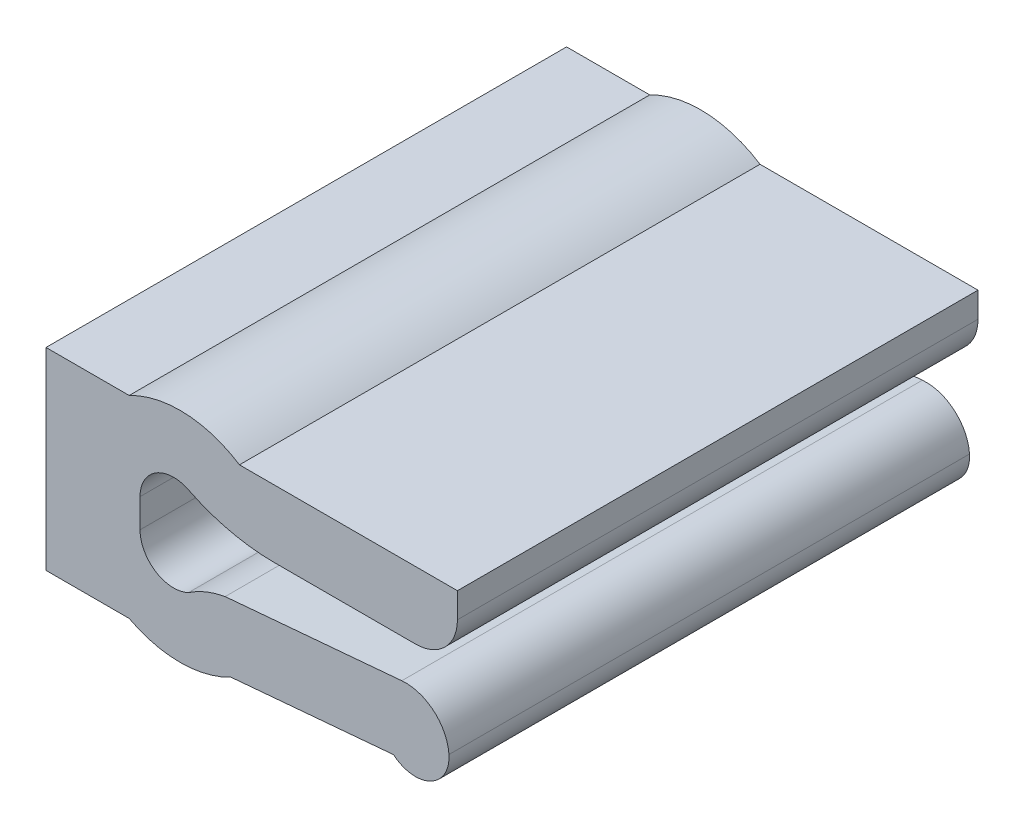
ISO-10303-21;
HEADER;
FILE_DESCRIPTION(('STEP AP214'),'2;1');
FILE_NAME('part.step','',(''),(''),'','','');
FILE_SCHEMA(('AUTOMOTIVE_DESIGN { 1 0 10303 214 1 1 1 1 }'));
ENDSEC;
DATA;
#1=APPLICATION_CONTEXT('core data for automotive mechanical design processes');
#2=APPLICATION_PROTOCOL_DEFINITION('international standard','automotive_design',2000,#1);
#3=PRODUCT_CONTEXT('',#1,'mechanical');
#4=PRODUCT('Part','Part','',(#3));
#5=PRODUCT_RELATED_PRODUCT_CATEGORY('part','',(#4));
#6=PRODUCT_DEFINITION_FORMATION('','',#4);
#7=PRODUCT_DEFINITION_CONTEXT('part definition',#1,'design');
#8=PRODUCT_DEFINITION('design','',#6,#7);
#9=PRODUCT_DEFINITION_SHAPE('','',#8);
#10=(LENGTH_UNIT() NAMED_UNIT(*) SI_UNIT(.MILLI.,.METRE.));
#11=(NAMED_UNIT(*) PLANE_ANGLE_UNIT() SI_UNIT($,.RADIAN.));
#12=(NAMED_UNIT(*) SI_UNIT($,.STERADIAN.) SOLID_ANGLE_UNIT());
#13=UNCERTAINTY_MEASURE_WITH_UNIT(LENGTH_MEASURE(1.E-05),#10,'distance_accuracy_value','');
#14=(GEOMETRIC_REPRESENTATION_CONTEXT(3) GLOBAL_UNCERTAINTY_ASSIGNED_CONTEXT((#13)) GLOBAL_UNIT_ASSIGNED_CONTEXT((#10,
#11,#12)) REPRESENTATION_CONTEXT('',''));
#15=CARTESIAN_POINT('',(0.,0.,0.));
#16=DIRECTION('',(0.,0.,1.));
#17=DIRECTION('',(1.,0.,0.));
#18=AXIS2_PLACEMENT_3D('',#15,#16,#17);
#19=CARTESIAN_POINT('',(5.89926469786375,-3.67623419089825,7.874));
#20=DIRECTION('',(0.,0.,-1.));
#21=DIRECTION('',(-1.,0.,0.));
#22=AXIS2_PLACEMENT_3D('',#19,#20,#21);
#23=CYLINDRICAL_SURFACE('',#22,2.82068826882834);
#24=CARTESIAN_POINT('',(5.89926469786375,-3.67623419089825,7.874));
#25=DIRECTION('',(0.,0.,-1.));
#26=DIRECTION('',(-1.,0.,0.));
#27=AXIS2_PLACEMENT_3D('',#24,#25,#26);
#28=CIRCLE('',#27,2.82068826882834);
#29=CARTESIAN_POINT('',(4.31082797047641,-1.34532212198771,7.874));
#30=VERTEX_POINT('',#29);
#31=CARTESIAN_POINT('',(5.4190023145138,-0.896732373477573,7.874));
#32=VERTEX_POINT('',#31);
#33=EDGE_CURVE('E137',#30,#32,#28,.T.);
#34=ORIENTED_EDGE('',*,*,#33,.T.);
#35=DIRECTION('',(0.,0.,1.));
#36=VECTOR('',#35,1.);
#37=CARTESIAN_POINT('',(5.4190023145138,-0.896732373477573,7.874));
#38=LINE('',#37,#36);
#39=CARTESIAN_POINT('',(5.4190023145138,-0.896732373477573,-7.874));
#40=VERTEX_POINT('',#39);
#41=EDGE_CURVE('E135',#32,#40,#38,.F.);
#42=ORIENTED_EDGE('',*,*,#41,.T.);
#43=CARTESIAN_POINT('',(5.89926469786375,-3.67623419089825,-7.874));
#44=DIRECTION('',(0.,0.,-1.));
#45=DIRECTION('',(-1.,0.,0.));
#46=AXIS2_PLACEMENT_3D('',#43,#44,#45);
#47=CIRCLE('',#46,2.82068826882834);
#48=CARTESIAN_POINT('',(4.31082797047641,-1.34532212198771,-7.874));
#49=VERTEX_POINT('',#48);
#50=EDGE_CURVE('E20',#40,#49,#47,.F.);
#51=ORIENTED_EDGE('',*,*,#50,.T.);
#52=DIRECTION('',(0.,0.,-1.));
#53=VECTOR('',#52,1.);
#54=CARTESIAN_POINT('',(4.31082797047641,-1.34532212198771,7.874));
#55=LINE('',#54,#53);
#56=EDGE_CURVE('E132',#49,#30,#55,.F.);
#57=ORIENTED_EDGE('',*,*,#56,.T.);
#58=EDGE_LOOP('',(#34,#42,#51,#57));
#59=FACE_BOUND('',#58,.T.);
#60=ADVANCED_FACE('F17',(#59),#23,.T.);
#61=CARTESIAN_POINT('',(2.8448,0.434426504593,7.874));
#62=DIRECTION('',(-1.,0.,0.));
#63=DIRECTION('',(0.,0.,1.));
#64=AXIS2_PLACEMENT_3D('',#61,#62,#63);
#65=PLANE('',#64);
#66=DIRECTION('',(0.,0.,-1.));
#67=VECTOR('',#66,1.);
#68=CARTESIAN_POINT('',(2.8448,0.434426504593,7.874));
#69=LINE('',#68,#67);
#70=CARTESIAN_POINT('',(2.8448,0.434426504593,-7.874));
#71=VERTEX_POINT('',#70);
#72=CARTESIAN_POINT('',(2.8448,0.434426504593,7.874));
#73=VERTEX_POINT('',#72);
#74=EDGE_CURVE('E275',#71,#73,#69,.F.);
#75=ORIENTED_EDGE('',*,*,#74,.T.);
#76=DIRECTION('',(0.,1.,0.));
#77=VECTOR('',#76,1.);
#78=CARTESIAN_POINT('',(2.8448,0.434426504593,7.874));
#79=LINE('',#78,#77);
#80=CARTESIAN_POINT('',(2.8448,-0.434426504593,7.874));
#81=VERTEX_POINT('',#80);
#82=EDGE_CURVE('E192',#81,#73,#79,.T.);
#83=ORIENTED_EDGE('',*,*,#82,.F.);
#84=DIRECTION('',(0.,0.,-1.));
#85=VECTOR('',#84,1.);
#86=CARTESIAN_POINT('',(2.8448,-0.434426504593,7.874));
#87=LINE('',#86,#85);
#88=CARTESIAN_POINT('',(2.8448,-0.434426504593,-7.874));
#89=VERTEX_POINT('',#88);
#90=EDGE_CURVE('E145',#81,#89,#87,.T.);
#91=ORIENTED_EDGE('',*,*,#90,.T.);
#92=DIRECTION('',(0.,1.,0.));
#93=VECTOR('',#92,1.);
#94=CARTESIAN_POINT('',(2.8448,0.434426504593,-7.874));
#95=LINE('',#94,#93);
#96=EDGE_CURVE('E149',#71,#89,#95,.F.);
#97=ORIENTED_EDGE('',*,*,#96,.F.);
#98=EDGE_LOOP('',(#75,#83,#91,#97));
#99=FACE_BOUND('',#98,.T.);
#100=ADVANCED_FACE('F367',(#99),#65,.F.);
#101=CARTESIAN_POINT('',(0.,2.921,7.874));
#102=DIRECTION('',(1.,0.,0.));
#103=DIRECTION('',(0.,1.,0.));
#104=AXIS2_PLACEMENT_3D('',#101,#102,#103);
#105=PLANE('',#104);
#106=DIRECTION('',(0.,0.,1.));
#107=VECTOR('',#106,1.);
#108=CARTESIAN_POINT('',(0.,-2.921,7.874));
#109=LINE('',#108,#107);
#110=CARTESIAN_POINT('',(0.,-2.921,-7.874));
#111=VERTEX_POINT('',#110);
#112=CARTESIAN_POINT('',(0.,-2.921,7.874));
#113=VERTEX_POINT('',#112);
#114=EDGE_CURVE('E196',#111,#113,#109,.T.);
#115=ORIENTED_EDGE('',*,*,#114,.T.);
#116=DIRECTION('',(0.,1.,0.));
#117=VECTOR('',#116,1.);
#118=CARTESIAN_POINT('',(0.,0.,7.874));
#119=LINE('',#118,#117);
#120=CARTESIAN_POINT('',(0.,2.921,7.874));
#121=VERTEX_POINT('',#120);
#122=EDGE_CURVE('E248',#121,#113,#119,.F.);
#123=ORIENTED_EDGE('',*,*,#122,.F.);
#124=DIRECTION('',(0.,0.,-1.));
#125=VECTOR('',#124,1.);
#126=CARTESIAN_POINT('',(0.,2.921,7.874));
#127=LINE('',#126,#125);
#128=CARTESIAN_POINT('',(0.,2.921,-7.874));
#129=VERTEX_POINT('',#128);
#130=EDGE_CURVE('E257',#121,#129,#127,.T.);
#131=ORIENTED_EDGE('',*,*,#130,.T.);
#132=DIRECTION('',(0.,1.,0.));
#133=VECTOR('',#132,1.);
#134=CARTESIAN_POINT('',(0.,0.,-7.874));
#135=LINE('',#134,#133);
#136=EDGE_CURVE('E173',#129,#111,#135,.F.);
#137=ORIENTED_EDGE('',*,*,#136,.T.);
#138=EDGE_LOOP('',(#115,#123,#131,#137));
#139=FACE_BOUND('',#138,.T.);
#140=ADVANCED_FACE('F306',(#139),#105,.F.);
#141=CARTESIAN_POINT('',(0.,-2.921,7.874));
#142=DIRECTION('',(0.,1.,0.));
#143=DIRECTION('',(0.,0.,1.));
#144=AXIS2_PLACEMENT_3D('',#141,#142,#143);
#145=PLANE('',#144);
#146=DIRECTION('',(0.,0.,-1.));
#147=VECTOR('',#146,1.);
#148=CARTESIAN_POINT('',(2.51651644791958,-2.921,7.874));
#149=LINE('',#148,#147);
#150=CARTESIAN_POINT('',(2.51651644791958,-2.921,7.874));
#151=VERTEX_POINT('',#150);
#152=CARTESIAN_POINT('',(2.51651644791958,-2.921,-7.874));
#153=VERTEX_POINT('',#152);
#154=EDGE_CURVE('E289',#151,#153,#149,.T.);
#155=ORIENTED_EDGE('',*,*,#154,.F.);
#156=DIRECTION('',(1.,0.,0.));
#157=VECTOR('',#156,1.);
#158=CARTESIAN_POINT('',(4.05630961584831,-2.921,7.874));
#159=LINE('',#158,#157);
#160=EDGE_CURVE('E191',#113,#151,#159,.T.);
#161=ORIENTED_EDGE('',*,*,#160,.F.);
#162=ORIENTED_EDGE('',*,*,#114,.F.);
#163=DIRECTION('',(1.,0.,0.));
#164=VECTOR('',#163,1.);
#165=CARTESIAN_POINT('',(4.05630961584831,-2.921,-7.874));
#166=LINE('',#165,#164);
#167=EDGE_CURVE('E170',#111,#153,#166,.T.);
#168=ORIENTED_EDGE('',*,*,#167,.T.);
#169=EDGE_LOOP('',(#155,#161,#162,#168));
#170=FACE_BOUND('',#169,.T.);
#171=ADVANCED_FACE('F310',(#170),#145,.F.);
#172=CARTESIAN_POINT('',(4.05630961584831,0.,7.874));
#173=DIRECTION('',(0.,0.,-1.));
#174=DIRECTION('',(-1.,0.,0.));
#175=AXIS2_PLACEMENT_3D('',#172,#173,#174);
#176=CYLINDRICAL_SURFACE('',#175,3.302);
#177=CARTESIAN_POINT('',(4.05630961584831,0.,7.874));
#178=DIRECTION('',(0.,0.,-1.));
#179=DIRECTION('',(-1.,0.,0.));
#180=AXIS2_PLACEMENT_3D('',#177,#178,#179);
#181=CIRCLE('',#180,3.302);
#182=CARTESIAN_POINT('',(5.59610278377704,-2.921,7.874));
#183=VERTEX_POINT('',#182);
#184=EDGE_CURVE('E190',#151,#183,#181,.F.);
#185=ORIENTED_EDGE('',*,*,#184,.F.);
#186=ORIENTED_EDGE('',*,*,#154,.T.);
#187=CARTESIAN_POINT('',(4.05630961584831,0.,-7.874));
#188=DIRECTION('',(0.,0.,-1.));
#189=DIRECTION('',(-1.,0.,0.));
#190=AXIS2_PLACEMENT_3D('',#187,#188,#189);
#191=CIRCLE('',#190,3.302);
#192=CARTESIAN_POINT('',(5.59610278377704,-2.921,-7.874));
#193=VERTEX_POINT('',#192);
#194=EDGE_CURVE('E167',#153,#193,#191,.F.);
#195=ORIENTED_EDGE('',*,*,#194,.T.);
#196=DIRECTION('',(0.,0.,1.));
#197=VECTOR('',#196,1.);
#198=CARTESIAN_POINT('',(5.59610278377704,-2.921,7.874));
#199=LINE('',#198,#197);
#200=EDGE_CURVE('E286',#193,#183,#199,.T.);
#201=ORIENTED_EDGE('',*,*,#200,.T.);
#202=EDGE_LOOP('',(#185,#186,#195,#201));
#203=FACE_BOUND('',#202,.T.);
#204=ADVANCED_FACE('F314',(#203),#176,.T.);
#205=CARTESIAN_POINT('',(5.59610278377704,-2.921,7.874));
#206=DIRECTION('',(-0.0871557427476585,0.996194698091746,0.));
#207=DIRECTION('',(-0.996194698091746,-0.0871557427476585,0.));
#208=AXIS2_PLACEMENT_3D('',#205,#206,#207);
#209=PLANE('',#208);
#210=DIRECTION('',(0.,0.,-1.));
#211=VECTOR('',#210,1.);
#212=CARTESIAN_POINT('',(10.5152539806553,-2.49063003610317,7.874));
#213=LINE('',#212,#211);
#214=CARTESIAN_POINT('',(10.5152539806553,-2.49063003610317,7.874));
#215=VERTEX_POINT('',#214);
#216=CARTESIAN_POINT('',(10.5152539806553,-2.49063003610317,-7.874));
#217=VERTEX_POINT('',#216);
#218=EDGE_CURVE('E284',#215,#217,#213,.T.);
#219=ORIENTED_EDGE('',*,*,#218,.F.);
#220=DIRECTION('',(0.996194698091746,0.0871557427476586,0.));
#221=VECTOR('',#220,1.);
#222=CARTESIAN_POINT('',(5.59610278377704,-2.921,7.874));
#223=LINE('',#222,#221);
#224=EDGE_CURVE('E189',#183,#215,#223,.T.);
#225=ORIENTED_EDGE('',*,*,#224,.F.);
#226=ORIENTED_EDGE('',*,*,#200,.F.);
#227=DIRECTION('',(0.996194698091746,0.0871557427476586,0.));
#228=VECTOR('',#227,1.);
#229=CARTESIAN_POINT('',(5.59610278377704,-2.921,-7.874));
#230=LINE('',#229,#228);
#231=EDGE_CURVE('E166',#193,#217,#230,.T.);
#232=ORIENTED_EDGE('',*,*,#231,.T.);
#233=EDGE_LOOP('',(#219,#225,#226,#232));
#234=FACE_BOUND('',#233,.T.);
#235=ADVANCED_FACE('F320',(#234),#209,.F.);
#236=CARTESIAN_POINT('',(11.176,-1.71883297863265,7.874));
#237=DIRECTION('',(0.,0.,-1.));
#238=DIRECTION('',(-1.,0.,0.));
#239=AXIS2_PLACEMENT_3D('',#236,#237,#238);
#240=CYLINDRICAL_SURFACE('',#239,1.01600000000001);
#241=CARTESIAN_POINT('',(11.176,-1.71883297863265,7.874));
#242=DIRECTION('',(0.,0.,-1.));
#243=DIRECTION('',(-1.,0.,0.));
#244=AXIS2_PLACEMENT_3D('',#241,#242,#243);
#245=CIRCLE('',#244,1.01600000000001);
#246=CARTESIAN_POINT('',(12.1896770648997,-1.65016851842037,7.874));
#247=VERTEX_POINT('',#246);
#248=EDGE_CURVE('E187',#215,#247,#245,.F.);
#249=ORIENTED_EDGE('',*,*,#248,.F.);
#250=ORIENTED_EDGE('',*,*,#218,.T.);
#251=CARTESIAN_POINT('',(11.176,-1.71883297863265,-7.874));
#252=DIRECTION('',(0.,0.,-1.));
#253=DIRECTION('',(-1.,0.,0.));
#254=AXIS2_PLACEMENT_3D('',#251,#252,#253);
#255=CIRCLE('',#254,1.01600000000001);
#256=CARTESIAN_POINT('',(12.1896770648997,-1.65016851842037,-7.874));
#257=VERTEX_POINT('',#256);
#258=EDGE_CURVE('E163',#217,#257,#255,.F.);
#259=ORIENTED_EDGE('',*,*,#258,.T.);
#260=DIRECTION('',(0.,0.,-1.));
#261=VECTOR('',#260,1.);
#262=CARTESIAN_POINT('',(12.1896770648997,-1.65016851842037,7.874));
#263=LINE('',#262,#261);
#264=EDGE_CURVE('E281',#247,#257,#263,.T.);
#265=ORIENTED_EDGE('',*,*,#264,.F.);
#266=EDGE_LOOP('',(#249,#250,#259,#265));
#267=FACE_BOUND('',#266,.T.);
#268=ADVANCED_FACE('F324',(#267),#240,.T.);
#269=CARTESIAN_POINT('',(10.8778224220482,-1.73903093234633,7.874));
#270=DIRECTION('',(0.,0.,-1.));
#271=DIRECTION('',(-1.,0.,0.));
#272=AXIS2_PLACEMENT_3D('',#269,#270,#271);
#273=CYLINDRICAL_SURFACE('',#272,1.31486087955339);
#274=CARTESIAN_POINT('',(10.8778224220482,-1.73903093234633,7.874));
#275=DIRECTION('',(0.,0.,-1.));
#276=DIRECTION('',(-1.,0.,0.));
#277=AXIS2_PLACEMENT_3D('',#274,#275,#276);
#278=CIRCLE('',#277,1.31486087955339);
#279=CARTESIAN_POINT('',(10.7632247454809,-0.429173495406995,7.874));
#280=VERTEX_POINT('',#279);
#281=EDGE_CURVE('E185',#247,#280,#278,.F.);
#282=ORIENTED_EDGE('',*,*,#281,.F.);
#283=ORIENTED_EDGE('',*,*,#264,.T.);
#284=CARTESIAN_POINT('',(10.8778224220482,-1.73903093234633,-7.874));
#285=DIRECTION('',(0.,0.,-1.));
#286=DIRECTION('',(-1.,0.,0.));
#287=AXIS2_PLACEMENT_3D('',#284,#285,#286);
#288=CIRCLE('',#287,1.31486087955339);
#289=CARTESIAN_POINT('',(10.7632247454809,-0.429173495406995,-7.874));
#290=VERTEX_POINT('',#289);
#291=EDGE_CURVE('E157',#257,#290,#288,.F.);
#292=ORIENTED_EDGE('',*,*,#291,.T.);
#293=DIRECTION('',(0.,0.,1.));
#294=VECTOR('',#293,1.);
#295=CARTESIAN_POINT('',(10.7632247454809,-0.429173495406998,7.874));
#296=LINE('',#295,#294);
#297=EDGE_CURVE('E278',#290,#280,#296,.T.);
#298=ORIENTED_EDGE('',*,*,#297,.T.);
#299=EDGE_LOOP('',(#282,#283,#292,#298));
#300=FACE_BOUND('',#299,.T.);
#301=ADVANCED_FACE('F328',(#300),#273,.T.);
#302=CARTESIAN_POINT('',(5.4190023145138,-0.896732373477573,7.874));
#303=DIRECTION('',(0.0871557427476581,-0.996194698091746,0.));
#304=DIRECTION('',(0.996194698091746,0.0871557427476581,0.));
#305=AXIS2_PLACEMENT_3D('',#302,#303,#304);
#306=PLANE('',#305);
#307=ORIENTED_EDGE('',*,*,#41,.F.);
#308=DIRECTION('',(-0.996194698091745,-0.0871557427476592,0.));
#309=VECTOR('',#308,1.);
#310=CARTESIAN_POINT('',(10.7632247454809,-0.429173495406992,7.874));
#311=LINE('',#310,#309);
#312=EDGE_CURVE('E184',#280,#32,#311,.T.);
#313=ORIENTED_EDGE('',*,*,#312,.F.);
#314=ORIENTED_EDGE('',*,*,#297,.F.);
#315=DIRECTION('',(-0.996194698091745,-0.0871557427476592,0.));
#316=VECTOR('',#315,1.);
#317=CARTESIAN_POINT('',(10.7632247454809,-0.429173495406992,-7.874));
#318=LINE('',#317,#316);
#319=EDGE_CURVE('E152',#290,#40,#318,.T.);
#320=ORIENTED_EDGE('',*,*,#319,.T.);
#321=EDGE_LOOP('',(#307,#313,#314,#320));
#322=FACE_BOUND('',#321,.T.);
#323=ADVANCED_FACE('F331',(#322),#306,.F.);
#324=CARTESIAN_POINT('',(3.8608,-0.434426504593,7.874));
#325=DIRECTION('',(0.,0.,-1.));
#326=DIRECTION('',(-1.,0.,0.));
#327=AXIS2_PLACEMENT_3D('',#324,#325,#326);
#328=CYLINDRICAL_SURFACE('',#327,1.016);
#329=ORIENTED_EDGE('',*,*,#90,.F.);
#330=CARTESIAN_POINT('',(3.8608,-0.434426504593,7.874));
#331=DIRECTION('',(0.,0.,-1.));
#332=DIRECTION('',(-1.,0.,0.));
#333=AXIS2_PLACEMENT_3D('',#330,#331,#332);
#334=CIRCLE('',#333,1.016);
#335=EDGE_CURVE('E144',#30,#81,#334,.T.);
#336=ORIENTED_EDGE('',*,*,#335,.F.);
#337=ORIENTED_EDGE('',*,*,#56,.F.);
#338=CARTESIAN_POINT('',(3.8608,-0.434426504593,-7.874));
#339=DIRECTION('',(0.,0.,-1.));
#340=DIRECTION('',(-1.,0.,0.));
#341=AXIS2_PLACEMENT_3D('',#338,#339,#340);
#342=CIRCLE('',#341,1.016);
#343=EDGE_CURVE('E142',#49,#89,#342,.T.);
#344=ORIENTED_EDGE('',*,*,#343,.T.);
#345=EDGE_LOOP('',(#329,#336,#337,#344));
#346=FACE_BOUND('',#345,.T.);
#347=ADVANCED_FACE('F141',(#346),#328,.F.);
#348=CARTESIAN_POINT('',(3.8608,0.434426504593,7.874));
#349=DIRECTION('',(0.,0.,-1.));
#350=DIRECTION('',(-1.,0.,0.));
#351=AXIS2_PLACEMENT_3D('',#348,#349,#350);
#352=CYLINDRICAL_SURFACE('',#351,1.016);
#353=DIRECTION('',(0.,0.,-1.));
#354=VECTOR('',#353,1.);
#355=CARTESIAN_POINT('',(4.31082797047641,1.34532212198771,7.874));
#356=LINE('',#355,#354);
#357=CARTESIAN_POINT('',(4.31082797047641,1.34532212198771,7.874));
#358=VERTEX_POINT('',#357);
#359=CARTESIAN_POINT('',(4.31082797047641,1.34532212198771,-7.874));
#360=VERTEX_POINT('',#359);
#361=EDGE_CURVE('E273',#358,#360,#356,.T.);
#362=ORIENTED_EDGE('',*,*,#361,.F.);
#363=CARTESIAN_POINT('',(3.8608,0.434426504593,7.874));
#364=DIRECTION('',(0.,0.,-1.));
#365=DIRECTION('',(-1.,0.,0.));
#366=AXIS2_PLACEMENT_3D('',#363,#364,#365);
#367=CIRCLE('',#366,1.016);
#368=EDGE_CURVE('E181',#73,#358,#367,.T.);
#369=ORIENTED_EDGE('',*,*,#368,.F.);
#370=ORIENTED_EDGE('',*,*,#74,.F.);
#371=CARTESIAN_POINT('',(3.8608,0.434426504593,-7.874));
#372=DIRECTION('',(0.,0.,-1.));
#373=DIRECTION('',(-1.,0.,0.));
#374=AXIS2_PLACEMENT_3D('',#371,#372,#373);
#375=CIRCLE('',#374,1.016);
#376=EDGE_CURVE('E151',#71,#360,#375,.T.);
#377=ORIENTED_EDGE('',*,*,#376,.T.);
#378=EDGE_LOOP('',(#362,#369,#370,#377));
#379=FACE_BOUND('',#378,.T.);
#380=ADVANCED_FACE('F363',(#379),#352,.F.);
#381=CARTESIAN_POINT('',(6.90596219656385,6.59809872294336,7.874));
#382=DIRECTION('',(0.,0.,-1.));
#383=DIRECTION('',(-1.,0.,0.));
#384=AXIS2_PLACEMENT_3D('',#381,#382,#383);
#385=CYLINDRICAL_SURFACE('',#384,5.85887221835036);
#386=CARTESIAN_POINT('',(6.90596219656385,6.59809872294336,7.874));
#387=DIRECTION('',(0.,0.,-1.));
#388=DIRECTION('',(-1.,0.,0.));
#389=AXIS2_PLACEMENT_3D('',#386,#387,#388);
#390=CIRCLE('',#389,5.85887221835036);
#391=CARTESIAN_POINT('',(6.90596219656385,0.739226504593001,7.874));
#392=VERTEX_POINT('',#391);
#393=EDGE_CURVE('E179',#358,#392,#390,.F.);
#394=ORIENTED_EDGE('',*,*,#393,.F.);
#395=ORIENTED_EDGE('',*,*,#361,.T.);
#396=CARTESIAN_POINT('',(6.90596219656385,6.59809872294336,-7.874));
#397=DIRECTION('',(0.,0.,-1.));
#398=DIRECTION('',(-1.,0.,0.));
#399=AXIS2_PLACEMENT_3D('',#396,#397,#398);
#400=CIRCLE('',#399,5.85887221835036);
#401=CARTESIAN_POINT('',(6.90596219656385,0.739226504593001,-7.874));
#402=VERTEX_POINT('',#401);
#403=EDGE_CURVE('E155',#360,#402,#400,.F.);
#404=ORIENTED_EDGE('',*,*,#403,.T.);
#405=DIRECTION('',(0.,0.,1.));
#406=VECTOR('',#405,1.);
#407=CARTESIAN_POINT('',(6.90596219656385,0.739226504593001,7.874));
#408=LINE('',#407,#406);
#409=EDGE_CURVE('E271',#402,#392,#408,.T.);
#410=ORIENTED_EDGE('',*,*,#409,.T.);
#411=EDGE_LOOP('',(#394,#395,#404,#410));
#412=FACE_BOUND('',#411,.T.);
#413=ADVANCED_FACE('F395',(#412),#385,.T.);
#414=CARTESIAN_POINT('',(11.176,0.739226504593002,7.874));
#415=DIRECTION('',(0.,1.,0.));
#416=DIRECTION('',(-1.,0.,0.));
#417=AXIS2_PLACEMENT_3D('',#414,#415,#416);
#418=PLANE('',#417);
#419=DIRECTION('',(0.,0.,-1.));
#420=VECTOR('',#419,1.);
#421=CARTESIAN_POINT('',(11.176,0.739226504593002,7.874));
#422=LINE('',#421,#420);
#423=CARTESIAN_POINT('',(11.176,0.739226504593001,7.874));
#424=VERTEX_POINT('',#423);
#425=CARTESIAN_POINT('',(11.176,0.739226504593001,-7.874));
#426=VERTEX_POINT('',#425);
#427=EDGE_CURVE('E260',#424,#426,#422,.T.);
#428=ORIENTED_EDGE('',*,*,#427,.F.);
#429=DIRECTION('',(1.,0.,0.));
#430=VECTOR('',#429,1.);
#431=CARTESIAN_POINT('',(4.05630961584831,0.739226504593001,7.874));
#432=LINE('',#431,#430);
#433=EDGE_CURVE('E178',#392,#424,#432,.T.);
#434=ORIENTED_EDGE('',*,*,#433,.F.);
#435=ORIENTED_EDGE('',*,*,#409,.F.);
#436=DIRECTION('',(1.,0.,0.));
#437=VECTOR('',#436,1.);
#438=CARTESIAN_POINT('',(4.05630961584831,0.739226504593001,-7.874));
#439=LINE('',#438,#437);
#440=EDGE_CURVE('E205',#402,#426,#439,.T.);
#441=ORIENTED_EDGE('',*,*,#440,.T.);
#442=EDGE_LOOP('',(#428,#434,#435,#441));
#443=FACE_BOUND('',#442,.T.);
#444=ADVANCED_FACE('F392',(#443),#418,.F.);
#445=CARTESIAN_POINT('',(11.176,2.009226504593,7.874));
#446=DIRECTION('',(0.,0.,-1.));
#447=DIRECTION('',(-1.,0.,0.));
#448=AXIS2_PLACEMENT_3D('',#445,#446,#447);
#449=CYLINDRICAL_SURFACE('',#448,1.27);
#450=CARTESIAN_POINT('',(11.176,2.009226504593,7.874));
#451=DIRECTION('',(0.,0.,-1.));
#452=DIRECTION('',(-1.,0.,0.));
#453=AXIS2_PLACEMENT_3D('',#450,#451,#452);
#454=CIRCLE('',#453,1.27);
#455=CARTESIAN_POINT('',(12.446,2.009226504593,7.874));
#456=VERTEX_POINT('',#455);
#457=EDGE_CURVE('E175',#424,#456,#454,.F.);
#458=ORIENTED_EDGE('',*,*,#457,.F.);
#459=ORIENTED_EDGE('',*,*,#427,.T.);
#460=CARTESIAN_POINT('',(11.176,2.009226504593,-7.874));
#461=DIRECTION('',(0.,0.,-1.));
#462=DIRECTION('',(-1.,0.,0.));
#463=AXIS2_PLACEMENT_3D('',#460,#461,#462);
#464=CIRCLE('',#463,1.27);
#465=CARTESIAN_POINT('',(12.446,2.009226504593,-7.874));
#466=VERTEX_POINT('',#465);
#467=EDGE_CURVE('E203',#426,#466,#464,.F.);
#468=ORIENTED_EDGE('',*,*,#467,.T.);
#469=DIRECTION('',(0.,0.,1.));
#470=VECTOR('',#469,1.);
#471=CARTESIAN_POINT('',(12.446,2.009226504593,7.874));
#472=LINE('',#471,#470);
#473=EDGE_CURVE('E254',#466,#456,#472,.T.);
#474=ORIENTED_EDGE('',*,*,#473,.T.);
#475=EDGE_LOOP('',(#458,#459,#468,#474));
#476=FACE_BOUND('',#475,.T.);
#477=ADVANCED_FACE('F359',(#476),#449,.T.);
#478=CARTESIAN_POINT('',(0.,2.921,7.874));
#479=DIRECTION('',(0.,-1.,0.));
#480=DIRECTION('',(0.,0.,-1.));
#481=AXIS2_PLACEMENT_3D('',#478,#479,#480);
#482=PLANE('',#481);
#483=ORIENTED_EDGE('',*,*,#130,.F.);
#484=DIRECTION('',(1.,0.,0.));
#485=VECTOR('',#484,1.);
#486=CARTESIAN_POINT('',(4.05630961584831,2.921,7.874));
#487=LINE('',#486,#485);
#488=CARTESIAN_POINT('',(2.51651644791958,2.921,7.874));
#489=VERTEX_POINT('',#488);
#490=EDGE_CURVE('E251',#489,#121,#487,.F.);
#491=ORIENTED_EDGE('',*,*,#490,.F.);
#492=DIRECTION('',(0.,0.,-1.));
#493=VECTOR('',#492,1.);
#494=CARTESIAN_POINT('',(2.51651644791958,2.921,7.874));
#495=LINE('',#494,#493);
#496=CARTESIAN_POINT('',(2.51651644791958,2.921,-7.874));
#497=VERTEX_POINT('',#496);
#498=EDGE_CURVE('E174',#497,#489,#495,.F.);
#499=ORIENTED_EDGE('',*,*,#498,.F.);
#500=DIRECTION('',(1.,0.,0.));
#501=VECTOR('',#500,1.);
#502=CARTESIAN_POINT('',(4.05630961584831,2.921,-7.874));
#503=LINE('',#502,#501);
#504=EDGE_CURVE('E201',#497,#129,#503,.F.);
#505=ORIENTED_EDGE('',*,*,#504,.T.);
#506=EDGE_LOOP('',(#483,#491,#499,#505));
#507=FACE_BOUND('',#506,.T.);
#508=ADVANCED_FACE('F339',(#507),#482,.F.);
#509=CARTESIAN_POINT('',(12.446,2.771226504593,7.874));
#510=DIRECTION('',(-1.,0.,0.));
#511=DIRECTION('',(0.,0.,1.));
#512=AXIS2_PLACEMENT_3D('',#509,#510,#511);
#513=PLANE('',#512);
#514=DIRECTION('',(0.,0.,-1.));
#515=VECTOR('',#514,1.);
#516=CARTESIAN_POINT('',(12.446,2.771226504593,7.874));
#517=LINE('',#516,#515);
#518=CARTESIAN_POINT('',(12.446,2.771226504593,-7.874));
#519=VERTEX_POINT('',#518);
#520=CARTESIAN_POINT('',(12.446,2.771226504593,7.874));
#521=VERTEX_POINT('',#520);
#522=EDGE_CURVE('E230',#519,#521,#517,.F.);
#523=ORIENTED_EDGE('',*,*,#522,.T.);
#524=DIRECTION('',(0.,1.,0.));
#525=VECTOR('',#524,1.);
#526=CARTESIAN_POINT('',(12.446,0.,7.874));
#527=LINE('',#526,#525);
#528=EDGE_CURVE('E177',#456,#521,#527,.T.);
#529=ORIENTED_EDGE('',*,*,#528,.F.);
#530=ORIENTED_EDGE('',*,*,#473,.F.);
#531=DIRECTION('',(0.,1.,0.));
#532=VECTOR('',#531,1.);
#533=CARTESIAN_POINT('',(12.446,0.,-7.874));
#534=LINE('',#533,#532);
#535=EDGE_CURVE('E202',#466,#519,#534,.T.);
#536=ORIENTED_EDGE('',*,*,#535,.T.);
#537=EDGE_LOOP('',(#523,#529,#530,#536));
#538=FACE_BOUND('',#537,.T.);
#539=ADVANCED_FACE('F346',(#538),#513,.F.);
#540=CARTESIAN_POINT('',(4.05630961584831,0.,7.874));
#541=DIRECTION('',(0.,0.,1.));
#542=DIRECTION('',(1.,0.,0.));
#543=AXIS2_PLACEMENT_3D('',#540,#541,#542);
#544=PLANE('',#543);
#545=DIRECTION('',(1.,0.,0.));
#546=VECTOR('',#545,1.);
#547=CARTESIAN_POINT('',(5.85172256562929,2.771226504593,7.874));
#548=LINE('',#547,#546);
#549=CARTESIAN_POINT('',(5.85172256562929,2.771226504593,7.874));
#550=VERTEX_POINT('',#549);
#551=EDGE_CURVE('E226',#521,#550,#548,.F.);
#552=ORIENTED_EDGE('',*,*,#551,.T.);
#553=CARTESIAN_POINT('',(4.05630961584831,0.,7.874));
#554=DIRECTION('',(0.,0.,-1.));
#555=DIRECTION('',(-1.,0.,0.));
#556=AXIS2_PLACEMENT_3D('',#553,#554,#555);
#557=CIRCLE('',#556,3.302);
#558=EDGE_CURVE('E171',#489,#550,#557,.T.);
#559=ORIENTED_EDGE('',*,*,#558,.F.);
#560=ORIENTED_EDGE('',*,*,#490,.T.);
#561=ORIENTED_EDGE('',*,*,#122,.T.);
#562=ORIENTED_EDGE('',*,*,#160,.T.);
#563=ORIENTED_EDGE('',*,*,#184,.T.);
#564=ORIENTED_EDGE('',*,*,#224,.T.);
#565=ORIENTED_EDGE('',*,*,#248,.T.);
#566=ORIENTED_EDGE('',*,*,#281,.T.);
#567=ORIENTED_EDGE('',*,*,#312,.T.);
#568=ORIENTED_EDGE('',*,*,#33,.F.);
#569=ORIENTED_EDGE('',*,*,#335,.T.);
#570=ORIENTED_EDGE('',*,*,#82,.T.);
#571=ORIENTED_EDGE('',*,*,#368,.T.);
#572=ORIENTED_EDGE('',*,*,#393,.T.);
#573=ORIENTED_EDGE('',*,*,#433,.T.);
#574=ORIENTED_EDGE('',*,*,#457,.T.);
#575=ORIENTED_EDGE('',*,*,#528,.T.);
#576=EDGE_LOOP('',(#552,#559,#560,#561,#562,#563,#564,#565,#566,#567,#568,#569,#570,#571,#572,
#573,#574,#575));
#577=FACE_BOUND('',#576,.T.);
#578=ADVANCED_FACE('F298',(#577),#544,.T.);
#579=CARTESIAN_POINT('',(4.05630961584831,0.,7.874));
#580=DIRECTION('',(0.,0.,-1.));
#581=DIRECTION('',(-1.,0.,0.));
#582=AXIS2_PLACEMENT_3D('',#579,#580,#581);
#583=CYLINDRICAL_SURFACE('',#582,3.302);
#584=ORIENTED_EDGE('',*,*,#558,.T.);
#585=DIRECTION('',(0.,0.,-1.));
#586=VECTOR('',#585,1.);
#587=CARTESIAN_POINT('',(5.85172256562929,2.771226504593,7.874));
#588=LINE('',#587,#586);
#589=CARTESIAN_POINT('',(5.85172256562929,2.771226504593,-7.874));
#590=VERTEX_POINT('',#589);
#591=EDGE_CURVE('E26',#550,#590,#588,.T.);
#592=ORIENTED_EDGE('',*,*,#591,.T.);
#593=CARTESIAN_POINT('',(4.05630961584831,0.,-7.874));
#594=DIRECTION('',(0.,0.,-1.));
#595=DIRECTION('',(-1.,0.,0.));
#596=AXIS2_PLACEMENT_3D('',#593,#594,#595);
#597=CIRCLE('',#596,3.302);
#598=EDGE_CURVE('E34',#590,#497,#597,.F.);
#599=ORIENTED_EDGE('',*,*,#598,.T.);
#600=ORIENTED_EDGE('',*,*,#498,.T.);
#601=EDGE_LOOP('',(#584,#592,#599,#600));
#602=FACE_BOUND('',#601,.T.);
#603=ADVANCED_FACE('F355',(#602),#583,.T.);
#604=CARTESIAN_POINT('',(4.05630961584831,0.,-7.874));
#605=DIRECTION('',(0.,0.,1.));
#606=DIRECTION('',(1.,0.,0.));
#607=AXIS2_PLACEMENT_3D('',#604,#605,#606);
#608=PLANE('',#607);
#609=ORIENTED_EDGE('',*,*,#598,.F.);
#610=DIRECTION('',(1.,0.,0.));
#611=VECTOR('',#610,1.);
#612=CARTESIAN_POINT('',(5.85172256562929,2.771226504593,-7.874));
#613=LINE('',#612,#611);
#614=EDGE_CURVE('E11',#590,#519,#613,.T.);
#615=ORIENTED_EDGE('',*,*,#614,.T.);
#616=ORIENTED_EDGE('',*,*,#535,.F.);
#617=ORIENTED_EDGE('',*,*,#467,.F.);
#618=ORIENTED_EDGE('',*,*,#440,.F.);
#619=ORIENTED_EDGE('',*,*,#403,.F.);
#620=ORIENTED_EDGE('',*,*,#376,.F.);
#621=ORIENTED_EDGE('',*,*,#96,.T.);
#622=ORIENTED_EDGE('',*,*,#343,.F.);
#623=ORIENTED_EDGE('',*,*,#50,.F.);
#624=ORIENTED_EDGE('',*,*,#319,.F.);
#625=ORIENTED_EDGE('',*,*,#291,.F.);
#626=ORIENTED_EDGE('',*,*,#258,.F.);
#627=ORIENTED_EDGE('',*,*,#231,.F.);
#628=ORIENTED_EDGE('',*,*,#194,.F.);
#629=ORIENTED_EDGE('',*,*,#167,.F.);
#630=ORIENTED_EDGE('',*,*,#136,.F.);
#631=ORIENTED_EDGE('',*,*,#504,.F.);
#632=EDGE_LOOP('',(#609,#615,#616,#617,#618,#619,#620,#621,#622,#623,#624,#625,#626,#627,#628,
#629,#630,#631));
#633=FACE_BOUND('',#632,.T.);
#634=ADVANCED_FACE('F147',(#633),#608,.F.);
#635=CARTESIAN_POINT('',(5.85172256562929,2.771226504593,7.874));
#636=DIRECTION('',(0.,-1.,0.));
#637=DIRECTION('',(0.,0.,-1.));
#638=AXIS2_PLACEMENT_3D('',#635,#636,#637);
#639=PLANE('',#638);
#640=ORIENTED_EDGE('',*,*,#591,.F.);
#641=ORIENTED_EDGE('',*,*,#551,.F.);
#642=ORIENTED_EDGE('',*,*,#522,.F.);
#643=ORIENTED_EDGE('',*,*,#614,.F.);
#644=EDGE_LOOP('',(#640,#641,#642,#643));
#645=FACE_BOUND('',#644,.T.);
#646=ADVANCED_FACE('F352',(#645),#639,.F.);
#647=CLOSED_SHELL('',(#60,#100,#140,#171,#204,#235,#268,#301,#323,#347,#380,#413,#444,#477,#508,
#539,#578,#603,#634,#646));
#648=MANIFOLD_SOLID_BREP('B1',#647);
#649=ADVANCED_BREP_SHAPE_REPRESENTATION('',(#18,#648),#14);
#650=SHAPE_DEFINITION_REPRESENTATION(#9,#649);
ENDSEC;
END-ISO-10303-21;
